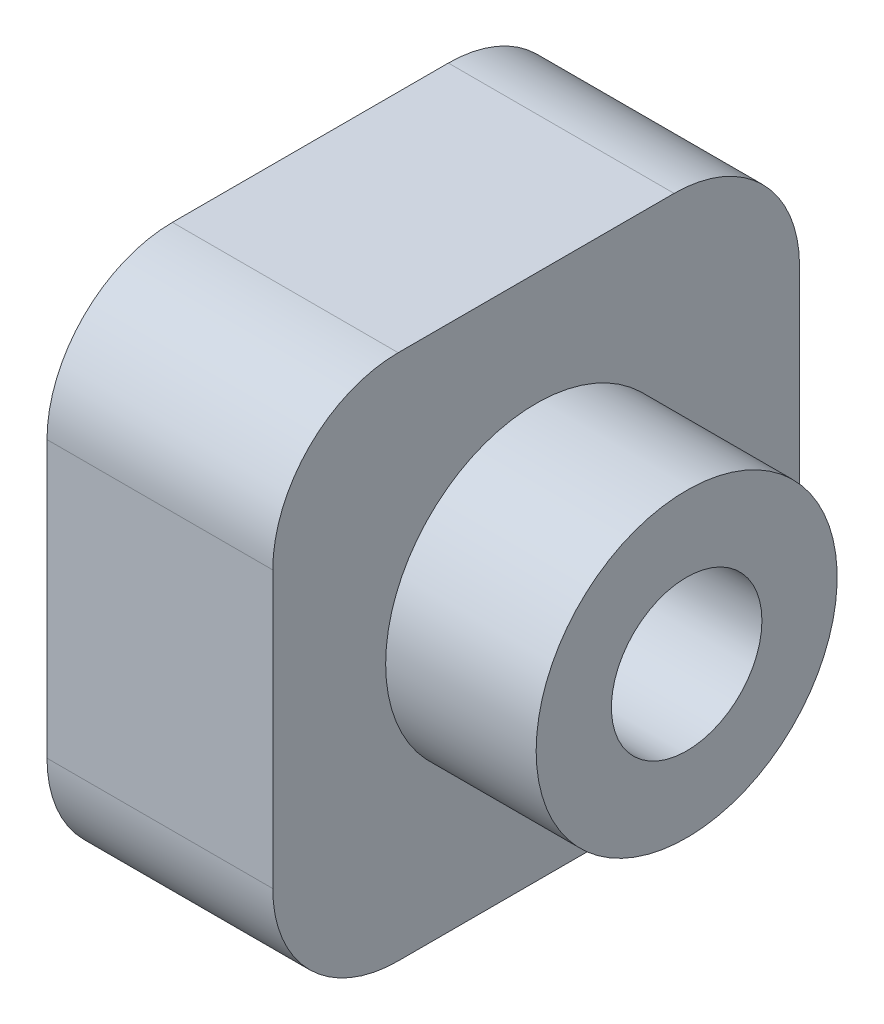
ISO-10303-21;
HEADER;
FILE_DESCRIPTION(('STEP AP214'),'2;1');
FILE_NAME('part.step','',(''),(''),'','','');
FILE_SCHEMA(('AUTOMOTIVE_DESIGN { 1 0 10303 214 1 1 1 1 }'));
ENDSEC;
DATA;
#1=APPLICATION_CONTEXT('core data for automotive mechanical design processes');
#2=APPLICATION_PROTOCOL_DEFINITION('international standard','automotive_design',2000,#1);
#3=PRODUCT_CONTEXT('',#1,'mechanical');
#4=PRODUCT('Part','Part','',(#3));
#5=PRODUCT_RELATED_PRODUCT_CATEGORY('part','',(#4));
#6=PRODUCT_DEFINITION_FORMATION('','',#4);
#7=PRODUCT_DEFINITION_CONTEXT('part definition',#1,'design');
#8=PRODUCT_DEFINITION('design','',#6,#7);
#9=PRODUCT_DEFINITION_SHAPE('','',#8);
#10=(LENGTH_UNIT() NAMED_UNIT(*) SI_UNIT(.MILLI.,.METRE.));
#11=(NAMED_UNIT(*) PLANE_ANGLE_UNIT() SI_UNIT($,.RADIAN.));
#12=(NAMED_UNIT(*) SI_UNIT($,.STERADIAN.) SOLID_ANGLE_UNIT());
#13=UNCERTAINTY_MEASURE_WITH_UNIT(LENGTH_MEASURE(1.E-05),#10,'distance_accuracy_value','');
#14=(GEOMETRIC_REPRESENTATION_CONTEXT(3) GLOBAL_UNCERTAINTY_ASSIGNED_CONTEXT((#13)) GLOBAL_UNIT_ASSIGNED_CONTEXT((#10,
#11,#12)) REPRESENTATION_CONTEXT('',''));
#15=CARTESIAN_POINT('',(0.,0.,0.));
#16=DIRECTION('',(0.,0.,1.));
#17=DIRECTION('',(1.,0.,0.));
#18=AXIS2_PLACEMENT_3D('',#15,#16,#17);
#19=CARTESIAN_POINT('',(7.,0.,0.));
#20=DIRECTION('',(-1.,0.,0.));
#21=DIRECTION('',(0.,0.,1.));
#22=AXIS2_PLACEMENT_3D('',#19,#20,#21);
#23=PLANE('',#22);
#24=CARTESIAN_POINT('',(7.,0.,0.));
#25=DIRECTION('',(-1.,0.,0.));
#26=DIRECTION('',(0.,0.,1.));
#27=AXIS2_PLACEMENT_3D('',#24,#25,#26);
#28=CIRCLE('',#27,6.);
#29=CARTESIAN_POINT('',(7.,0.,6.));
#30=VERTEX_POINT('',#29);
#31=EDGE_CURVE('E19',#30,#30,#28,.T.);
#32=ORIENTED_EDGE('',*,*,#31,.T.);
#33=EDGE_LOOP('',(#32));
#34=FACE_BOUND('',#33,.T.);
#35=CARTESIAN_POINT('',(7.,0.,0.));
#36=DIRECTION('',(1.,0.,0.));
#37=DIRECTION('',(0.,0.,-1.));
#38=AXIS2_PLACEMENT_3D('',#35,#36,#37);
#39=CIRCLE('',#38,3.);
#40=CARTESIAN_POINT('',(7.,0.,-3.));
#41=VERTEX_POINT('',#40);
#42=EDGE_CURVE('E143',#41,#41,#39,.T.);
#43=ORIENTED_EDGE('',*,*,#42,.T.);
#44=EDGE_LOOP('',(#43));
#45=FACE_BOUND('',#44,.T.);
#46=ADVANCED_FACE('F16',(#34,#45),#23,.T.);
#47=CARTESIAN_POINT('',(7.,0.,0.));
#48=DIRECTION('',(-1.,0.,0.));
#49=DIRECTION('',(0.,0.,1.));
#50=AXIS2_PLACEMENT_3D('',#47,#48,#49);
#51=CYLINDRICAL_SURFACE('',#50,6.);
#52=ORIENTED_EDGE('',*,*,#31,.F.);
#53=EDGE_LOOP('',(#52));
#54=FACE_BOUND('',#53,.T.);
#55=CARTESIAN_POINT('',(0.,0.,0.));
#56=DIRECTION('',(-1.,0.,0.));
#57=DIRECTION('',(0.,0.,1.));
#58=AXIS2_PLACEMENT_3D('',#55,#56,#57);
#59=CIRCLE('',#58,6.);
#60=CARTESIAN_POINT('',(0.,0.,6.));
#61=VERTEX_POINT('',#60);
#62=EDGE_CURVE('E141',#61,#61,#59,.T.);
#63=ORIENTED_EDGE('',*,*,#62,.T.);
#64=EDGE_LOOP('',(#63));
#65=FACE_BOUND('',#64,.T.);
#66=ADVANCED_FACE('F151',(#54,#65),#51,.F.);
#67=CARTESIAN_POINT('',(0.,0.,0.));
#68=DIRECTION('',(1.,0.,0.));
#69=DIRECTION('',(0.,0.,-1.));
#70=AXIS2_PLACEMENT_3D('',#67,#68,#69);
#71=CYLINDRICAL_SURFACE('',#70,3.);
#72=CARTESIAN_POINT('',(15.,0.,0.));
#73=DIRECTION('',(1.,0.,0.));
#74=DIRECTION('',(0.,0.,-1.));
#75=AXIS2_PLACEMENT_3D('',#72,#73,#74);
#76=CIRCLE('',#75,3.);
#77=CARTESIAN_POINT('',(15.,0.,-3.));
#78=VERTEX_POINT('',#77);
#79=EDGE_CURVE('E90',#78,#78,#76,.F.);
#80=ORIENTED_EDGE('',*,*,#79,.F.);
#81=EDGE_LOOP('',(#80));
#82=FACE_BOUND('',#81,.T.);
#83=ORIENTED_EDGE('',*,*,#42,.F.);
#84=EDGE_LOOP('',(#83));
#85=FACE_BOUND('',#84,.T.);
#86=ADVANCED_FACE('F154',(#82,#85),#71,.F.);
#87=CARTESIAN_POINT('',(0.,5.5,-5.5));
#88=DIRECTION('',(1.,0.,0.));
#89=DIRECTION('',(0.,0.,-1.));
#90=AXIS2_PLACEMENT_3D('',#87,#88,#89);
#91=PLANE('',#90);
#92=DIRECTION('',(0.,1.,0.));
#93=VECTOR('',#92,1.);
#94=CARTESIAN_POINT('',(0.,5.5,-10.5));
#95=LINE('',#94,#93);
#96=CARTESIAN_POINT('',(0.,5.5,-10.5));
#97=VERTEX_POINT('',#96);
#98=CARTESIAN_POINT('',(0.,-5.5,-10.5));
#99=VERTEX_POINT('',#98);
#100=EDGE_CURVE('E84',#97,#99,#95,.F.);
#101=ORIENTED_EDGE('',*,*,#100,.T.);
#102=CARTESIAN_POINT('',(0.,-5.5,-5.5));
#103=DIRECTION('',(-1.,0.,0.));
#104=DIRECTION('',(0.,0.,1.));
#105=AXIS2_PLACEMENT_3D('',#102,#103,#104);
#106=CIRCLE('',#105,5.);
#107=CARTESIAN_POINT('',(0.,-10.5,-5.5));
#108=VERTEX_POINT('',#107);
#109=EDGE_CURVE('E111',#108,#99,#106,.F.);
#110=ORIENTED_EDGE('',*,*,#109,.F.);
#111=DIRECTION('',(0.,0.,1.));
#112=VECTOR('',#111,1.);
#113=CARTESIAN_POINT('',(0.,-10.5,5.5));
#114=LINE('',#113,#112);
#115=CARTESIAN_POINT('',(0.,-10.5,5.5));
#116=VERTEX_POINT('',#115);
#117=EDGE_CURVE('E108',#108,#116,#114,.T.);
#118=ORIENTED_EDGE('',*,*,#117,.T.);
#119=CARTESIAN_POINT('',(0.,-5.5,5.5));
#120=DIRECTION('',(-1.,0.,0.));
#121=DIRECTION('',(0.,0.,1.));
#122=AXIS2_PLACEMENT_3D('',#119,#120,#121);
#123=CIRCLE('',#122,5.);
#124=CARTESIAN_POINT('',(0.,-5.5,10.5));
#125=VERTEX_POINT('',#124);
#126=EDGE_CURVE('E116',#125,#116,#123,.F.);
#127=ORIENTED_EDGE('',*,*,#126,.F.);
#128=DIRECTION('',(0.,1.,0.));
#129=VECTOR('',#128,1.);
#130=CARTESIAN_POINT('',(0.,5.5,10.5));
#131=LINE('',#130,#129);
#132=CARTESIAN_POINT('',(0.,5.5,10.5));
#133=VERTEX_POINT('',#132);
#134=EDGE_CURVE('E113',#125,#133,#131,.T.);
#135=ORIENTED_EDGE('',*,*,#134,.T.);
#136=CARTESIAN_POINT('',(0.,5.5,5.5));
#137=DIRECTION('',(-1.,0.,0.));
#138=DIRECTION('',(0.,0.,1.));
#139=AXIS2_PLACEMENT_3D('',#136,#137,#138);
#140=CIRCLE('',#139,5.);
#141=CARTESIAN_POINT('',(0.,10.5,5.5));
#142=VERTEX_POINT('',#141);
#143=EDGE_CURVE('E118',#142,#133,#140,.F.);
#144=ORIENTED_EDGE('',*,*,#143,.F.);
#145=DIRECTION('',(0.,0.,-1.));
#146=VECTOR('',#145,1.);
#147=CARTESIAN_POINT('',(0.,10.5,5.5));
#148=LINE('',#147,#146);
#149=CARTESIAN_POINT('',(0.,10.5,-5.5));
#150=VERTEX_POINT('',#149);
#151=EDGE_CURVE('E86',#142,#150,#148,.T.);
#152=ORIENTED_EDGE('',*,*,#151,.T.);
#153=CARTESIAN_POINT('',(0.,5.5,-5.5));
#154=DIRECTION('',(-1.,0.,0.));
#155=DIRECTION('',(0.,0.,1.));
#156=AXIS2_PLACEMENT_3D('',#153,#154,#155);
#157=CIRCLE('',#156,5.);
#158=EDGE_CURVE('E79',#97,#150,#157,.F.);
#159=ORIENTED_EDGE('',*,*,#158,.F.);
#160=EDGE_LOOP('',(#101,#110,#118,#127,#135,#144,#152,#159));
#161=FACE_BOUND('',#160,.T.);
#162=ORIENTED_EDGE('',*,*,#62,.F.);
#163=EDGE_LOOP('',(#162));
#164=FACE_BOUND('',#163,.T.);
#165=ADVANCED_FACE('F81',(#161,#164),#91,.F.);
#166=CARTESIAN_POINT('',(15.,0.,0.));
#167=DIRECTION('',(1.,0.,0.));
#168=DIRECTION('',(0.,0.,-1.));
#169=AXIS2_PLACEMENT_3D('',#166,#167,#168);
#170=PLANE('',#169);
#171=CARTESIAN_POINT('',(15.,0.,0.));
#172=DIRECTION('',(-1.,0.,0.));
#173=DIRECTION('',(0.,0.,1.));
#174=AXIS2_PLACEMENT_3D('',#171,#172,#173);
#175=CIRCLE('',#174,6.);
#176=CARTESIAN_POINT('',(15.,0.,6.));
#177=VERTEX_POINT('',#176);
#178=EDGE_CURVE('E101',#177,#177,#175,.T.);
#179=ORIENTED_EDGE('',*,*,#178,.F.);
#180=EDGE_LOOP('',(#179));
#181=FACE_BOUND('',#180,.T.);
#182=ORIENTED_EDGE('',*,*,#79,.T.);
#183=EDGE_LOOP('',(#182));
#184=FACE_BOUND('',#183,.T.);
#185=ADVANCED_FACE('F157',(#181,#184),#170,.T.);
#186=CARTESIAN_POINT('',(9.,5.5,-5.5));
#187=DIRECTION('',(-1.,0.,0.));
#188=DIRECTION('',(0.,0.,1.));
#189=AXIS2_PLACEMENT_3D('',#186,#187,#188);
#190=CYLINDRICAL_SURFACE('',#189,5.);
#191=CARTESIAN_POINT('',(9.,5.5,-5.5));
#192=DIRECTION('',(-1.,0.,0.));
#193=DIRECTION('',(0.,0.,1.));
#194=AXIS2_PLACEMENT_3D('',#191,#192,#193);
#195=CIRCLE('',#194,5.);
#196=CARTESIAN_POINT('',(9.,5.5,-10.5));
#197=VERTEX_POINT('',#196);
#198=CARTESIAN_POINT('',(9.,10.5,-5.5));
#199=VERTEX_POINT('',#198);
#200=EDGE_CURVE('E96',#197,#199,#195,.F.);
#201=ORIENTED_EDGE('',*,*,#200,.F.);
#202=DIRECTION('',(1.,0.,0.));
#203=VECTOR('',#202,1.);
#204=CARTESIAN_POINT('',(9.,5.5,-10.5));
#205=LINE('',#204,#203);
#206=EDGE_CURVE('E93',#197,#97,#205,.F.);
#207=ORIENTED_EDGE('',*,*,#206,.T.);
#208=ORIENTED_EDGE('',*,*,#158,.T.);
#209=DIRECTION('',(1.,0.,0.));
#210=VECTOR('',#209,1.);
#211=CARTESIAN_POINT('',(9.,10.5,-5.5));
#212=LINE('',#211,#210);
#213=EDGE_CURVE('E89',#150,#199,#212,.T.);
#214=ORIENTED_EDGE('',*,*,#213,.T.);
#215=EDGE_LOOP('',(#201,#207,#208,#214));
#216=FACE_BOUND('',#215,.T.);
#217=ADVANCED_FACE('F94',(#216),#190,.T.);
#218=CARTESIAN_POINT('',(9.,10.5,5.5));
#219=DIRECTION('',(0.,-1.,0.));
#220=DIRECTION('',(0.,0.,-1.));
#221=AXIS2_PLACEMENT_3D('',#218,#219,#220);
#222=PLANE('',#221);
#223=DIRECTION('',(-1.,0.,0.));
#224=VECTOR('',#223,1.);
#225=CARTESIAN_POINT('',(9.,10.5,5.5));
#226=LINE('',#225,#224);
#227=CARTESIAN_POINT('',(9.,10.5,5.5));
#228=VERTEX_POINT('',#227);
#229=EDGE_CURVE('E137',#228,#142,#226,.T.);
#230=ORIENTED_EDGE('',*,*,#229,.F.);
#231=DIRECTION('',(0.,0.,-1.));
#232=VECTOR('',#231,1.);
#233=CARTESIAN_POINT('',(9.,10.5,-5.5));
#234=LINE('',#233,#232);
#235=EDGE_CURVE('E131',#199,#228,#234,.F.);
#236=ORIENTED_EDGE('',*,*,#235,.F.);
#237=ORIENTED_EDGE('',*,*,#213,.F.);
#238=ORIENTED_EDGE('',*,*,#151,.F.);
#239=EDGE_LOOP('',(#230,#236,#237,#238));
#240=FACE_BOUND('',#239,.T.);
#241=ADVANCED_FACE('F200',(#240),#222,.F.);
#242=CARTESIAN_POINT('',(9.,5.5,5.5));
#243=DIRECTION('',(-1.,0.,0.));
#244=DIRECTION('',(0.,0.,1.));
#245=AXIS2_PLACEMENT_3D('',#242,#243,#244);
#246=CYLINDRICAL_SURFACE('',#245,5.);
#247=CARTESIAN_POINT('',(9.,5.5,5.5));
#248=DIRECTION('',(-1.,0.,0.));
#249=DIRECTION('',(0.,0.,1.));
#250=AXIS2_PLACEMENT_3D('',#247,#248,#249);
#251=CIRCLE('',#250,5.);
#252=CARTESIAN_POINT('',(9.,5.5,10.5));
#253=VERTEX_POINT('',#252);
#254=EDGE_CURVE('E128',#228,#253,#251,.F.);
#255=ORIENTED_EDGE('',*,*,#254,.F.);
#256=ORIENTED_EDGE('',*,*,#229,.T.);
#257=ORIENTED_EDGE('',*,*,#143,.T.);
#258=DIRECTION('',(1.,0.,0.));
#259=VECTOR('',#258,1.);
#260=CARTESIAN_POINT('',(9.,5.5,10.5));
#261=LINE('',#260,#259);
#262=EDGE_CURVE('E117',#133,#253,#261,.T.);
#263=ORIENTED_EDGE('',*,*,#262,.T.);
#264=EDGE_LOOP('',(#255,#256,#257,#263));
#265=FACE_BOUND('',#264,.T.);
#266=ADVANCED_FACE('F196',(#265),#246,.T.);
#267=CARTESIAN_POINT('',(9.,5.5,10.5));
#268=DIRECTION('',(0.,0.,-1.));
#269=DIRECTION('',(0.,1.,0.));
#270=AXIS2_PLACEMENT_3D('',#267,#268,#269);
#271=PLANE('',#270);
#272=DIRECTION('',(-1.,0.,0.));
#273=VECTOR('',#272,1.);
#274=CARTESIAN_POINT('',(9.,-5.5,10.5));
#275=LINE('',#274,#273);
#276=CARTESIAN_POINT('',(9.,-5.5,10.5));
#277=VERTEX_POINT('',#276);
#278=EDGE_CURVE('E136',#277,#125,#275,.T.);
#279=ORIENTED_EDGE('',*,*,#278,.F.);
#280=DIRECTION('',(0.,1.,0.));
#281=VECTOR('',#280,1.);
#282=CARTESIAN_POINT('',(9.,5.5,10.5));
#283=LINE('',#282,#281);
#284=EDGE_CURVE('E127',#253,#277,#283,.F.);
#285=ORIENTED_EDGE('',*,*,#284,.F.);
#286=ORIENTED_EDGE('',*,*,#262,.F.);
#287=ORIENTED_EDGE('',*,*,#134,.F.);
#288=EDGE_LOOP('',(#279,#285,#286,#287));
#289=FACE_BOUND('',#288,.T.);
#290=ADVANCED_FACE('F192',(#289),#271,.F.);
#291=CARTESIAN_POINT('',(9.,-5.5,5.5));
#292=DIRECTION('',(-1.,0.,0.));
#293=DIRECTION('',(0.,0.,1.));
#294=AXIS2_PLACEMENT_3D('',#291,#292,#293);
#295=CYLINDRICAL_SURFACE('',#294,5.);
#296=CARTESIAN_POINT('',(9.,-5.5,5.5));
#297=DIRECTION('',(-1.,0.,0.));
#298=DIRECTION('',(0.,0.,1.));
#299=AXIS2_PLACEMENT_3D('',#296,#297,#298);
#300=CIRCLE('',#299,5.);
#301=CARTESIAN_POINT('',(9.,-10.5,5.5));
#302=VERTEX_POINT('',#301);
#303=EDGE_CURVE('E124',#277,#302,#300,.F.);
#304=ORIENTED_EDGE('',*,*,#303,.F.);
#305=ORIENTED_EDGE('',*,*,#278,.T.);
#306=ORIENTED_EDGE('',*,*,#126,.T.);
#307=DIRECTION('',(1.,0.,0.));
#308=VECTOR('',#307,1.);
#309=CARTESIAN_POINT('',(9.,-10.5,5.5));
#310=LINE('',#309,#308);
#311=EDGE_CURVE('E112',#116,#302,#310,.T.);
#312=ORIENTED_EDGE('',*,*,#311,.T.);
#313=EDGE_LOOP('',(#304,#305,#306,#312));
#314=FACE_BOUND('',#313,.T.);
#315=ADVANCED_FACE('F188',(#314),#295,.T.);
#316=CARTESIAN_POINT('',(9.,-10.5,5.5));
#317=DIRECTION('',(0.,1.,0.));
#318=DIRECTION('',(0.,0.,1.));
#319=AXIS2_PLACEMENT_3D('',#316,#317,#318);
#320=PLANE('',#319);
#321=DIRECTION('',(-1.,0.,0.));
#322=VECTOR('',#321,1.);
#323=CARTESIAN_POINT('',(9.,-10.5,-5.5));
#324=LINE('',#323,#322);
#325=CARTESIAN_POINT('',(9.,-10.5,-5.5));
#326=VERTEX_POINT('',#325);
#327=EDGE_CURVE('E134',#326,#108,#324,.T.);
#328=ORIENTED_EDGE('',*,*,#327,.F.);
#329=DIRECTION('',(0.,0.,-1.));
#330=VECTOR('',#329,1.);
#331=CARTESIAN_POINT('',(9.,-10.5,-5.5));
#332=LINE('',#331,#330);
#333=EDGE_CURVE('E123',#302,#326,#332,.T.);
#334=ORIENTED_EDGE('',*,*,#333,.F.);
#335=ORIENTED_EDGE('',*,*,#311,.F.);
#336=ORIENTED_EDGE('',*,*,#117,.F.);
#337=EDGE_LOOP('',(#328,#334,#335,#336));
#338=FACE_BOUND('',#337,.T.);
#339=ADVANCED_FACE('F185',(#338),#320,.F.);
#340=CARTESIAN_POINT('',(9.,-5.5,-5.5));
#341=DIRECTION('',(-1.,0.,0.));
#342=DIRECTION('',(0.,0.,1.));
#343=AXIS2_PLACEMENT_3D('',#340,#341,#342);
#344=CYLINDRICAL_SURFACE('',#343,5.);
#345=CARTESIAN_POINT('',(9.,-5.5,-5.5));
#346=DIRECTION('',(-1.,0.,0.));
#347=DIRECTION('',(0.,0.,1.));
#348=AXIS2_PLACEMENT_3D('',#345,#346,#347);
#349=CIRCLE('',#348,5.);
#350=CARTESIAN_POINT('',(9.,-5.5,-10.5));
#351=VERTEX_POINT('',#350);
#352=EDGE_CURVE('E120',#326,#351,#349,.F.);
#353=ORIENTED_EDGE('',*,*,#352,.F.);
#354=ORIENTED_EDGE('',*,*,#327,.T.);
#355=ORIENTED_EDGE('',*,*,#109,.T.);
#356=DIRECTION('',(1.,0.,0.));
#357=VECTOR('',#356,1.);
#358=CARTESIAN_POINT('',(9.,-5.5,-10.5));
#359=LINE('',#358,#357);
#360=EDGE_CURVE('E34',#99,#351,#359,.T.);
#361=ORIENTED_EDGE('',*,*,#360,.T.);
#362=EDGE_LOOP('',(#353,#354,#355,#361));
#363=FACE_BOUND('',#362,.T.);
#364=ADVANCED_FACE('F182',(#363),#344,.T.);
#365=CARTESIAN_POINT('',(9.,5.5,-10.5));
#366=DIRECTION('',(0.,0.,1.));
#367=DIRECTION('',(1.,0.,0.));
#368=AXIS2_PLACEMENT_3D('',#365,#366,#367);
#369=PLANE('',#368);
#370=ORIENTED_EDGE('',*,*,#206,.F.);
#371=DIRECTION('',(0.,1.,0.));
#372=VECTOR('',#371,1.);
#373=CARTESIAN_POINT('',(9.,5.5,-10.5));
#374=LINE('',#373,#372);
#375=EDGE_CURVE('E25',#351,#197,#374,.T.);
#376=ORIENTED_EDGE('',*,*,#375,.F.);
#377=ORIENTED_EDGE('',*,*,#360,.F.);
#378=ORIENTED_EDGE('',*,*,#100,.F.);
#379=EDGE_LOOP('',(#370,#376,#377,#378));
#380=FACE_BOUND('',#379,.T.);
#381=ADVANCED_FACE('F100',(#380),#369,.F.);
#382=CARTESIAN_POINT('',(15.,0.,0.));
#383=DIRECTION('',(-1.,0.,0.));
#384=DIRECTION('',(0.,0.,1.));
#385=AXIS2_PLACEMENT_3D('',#382,#383,#384);
#386=CYLINDRICAL_SURFACE('',#385,6.);
#387=CARTESIAN_POINT('',(9.,0.,0.));
#388=DIRECTION('',(-1.,0.,0.));
#389=DIRECTION('',(0.,0.,1.));
#390=AXIS2_PLACEMENT_3D('',#387,#388,#389);
#391=CIRCLE('',#390,6.);
#392=CARTESIAN_POINT('',(9.,0.,6.));
#393=VERTEX_POINT('',#392);
#394=EDGE_CURVE('E10',#393,#393,#391,.T.);
#395=ORIENTED_EDGE('',*,*,#394,.F.);
#396=EDGE_LOOP('',(#395));
#397=FACE_BOUND('',#396,.T.);
#398=ORIENTED_EDGE('',*,*,#178,.T.);
#399=EDGE_LOOP('',(#398));
#400=FACE_BOUND('',#399,.T.);
#401=ADVANCED_FACE('F170',(#397,#400),#386,.T.);
#402=CARTESIAN_POINT('',(9.,5.5,-5.5));
#403=DIRECTION('',(1.,0.,0.));
#404=DIRECTION('',(0.,0.,-1.));
#405=AXIS2_PLACEMENT_3D('',#402,#403,#404);
#406=PLANE('',#405);
#407=ORIENTED_EDGE('',*,*,#394,.T.);
#408=EDGE_LOOP('',(#407));
#409=FACE_BOUND('',#408,.T.);
#410=ORIENTED_EDGE('',*,*,#352,.T.);
#411=ORIENTED_EDGE('',*,*,#375,.T.);
#412=ORIENTED_EDGE('',*,*,#200,.T.);
#413=ORIENTED_EDGE('',*,*,#235,.T.);
#414=ORIENTED_EDGE('',*,*,#254,.T.);
#415=ORIENTED_EDGE('',*,*,#284,.T.);
#416=ORIENTED_EDGE('',*,*,#303,.T.);
#417=ORIENTED_EDGE('',*,*,#333,.T.);
#418=EDGE_LOOP('',(#410,#411,#412,#413,#414,#415,#416,#417));
#419=FACE_BOUND('',#418,.T.);
#420=ADVANCED_FACE('F168',(#409,#419),#406,.T.);
#421=CLOSED_SHELL('',(#46,#66,#86,#165,#185,#217,#241,#266,#290,#315,#339,#364,#381,#401,#420));
#422=MANIFOLD_SOLID_BREP('B1',#421);
#423=ADVANCED_BREP_SHAPE_REPRESENTATION('',(#18,#422),#14);
#424=SHAPE_DEFINITION_REPRESENTATION(#9,#423);
ENDSEC;
END-ISO-10303-21;
